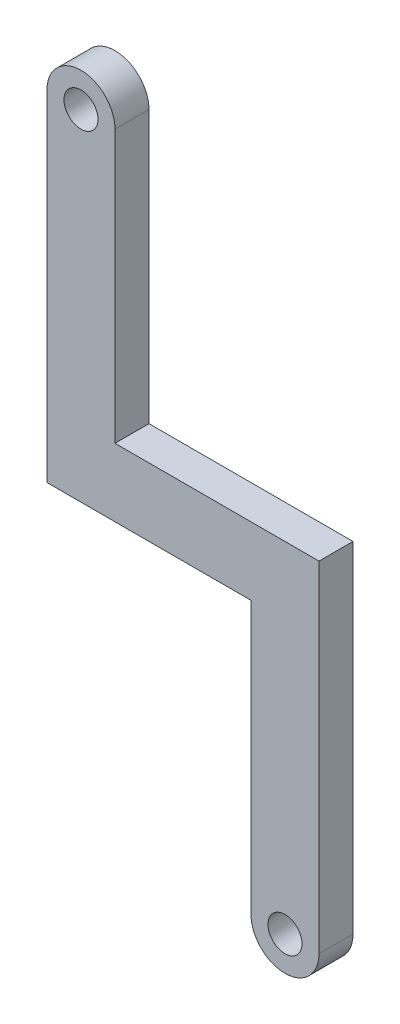
ISO-10303-21;
HEADER;
FILE_DESCRIPTION(('STEP AP214'),'2;1');
FILE_NAME('part.step','',(''),(''),'','','');
FILE_SCHEMA(('AUTOMOTIVE_DESIGN { 1 0 10303 214 1 1 1 1 }'));
ENDSEC;
DATA;
#1=APPLICATION_CONTEXT('core data for automotive mechanical design processes');
#2=APPLICATION_PROTOCOL_DEFINITION('international standard','automotive_design',2000,#1);
#3=PRODUCT_CONTEXT('',#1,'mechanical');
#4=PRODUCT('Part','Part','',(#3));
#5=PRODUCT_RELATED_PRODUCT_CATEGORY('part','',(#4));
#6=PRODUCT_DEFINITION_FORMATION('','',#4);
#7=PRODUCT_DEFINITION_CONTEXT('part definition',#1,'design');
#8=PRODUCT_DEFINITION('design','',#6,#7);
#9=PRODUCT_DEFINITION_SHAPE('','',#8);
#10=(LENGTH_UNIT() NAMED_UNIT(*) SI_UNIT(.MILLI.,.METRE.));
#11=(NAMED_UNIT(*) PLANE_ANGLE_UNIT() SI_UNIT($,.RADIAN.));
#12=(NAMED_UNIT(*) SI_UNIT($,.STERADIAN.) SOLID_ANGLE_UNIT());
#13=UNCERTAINTY_MEASURE_WITH_UNIT(LENGTH_MEASURE(1.E-05),#10,'distance_accuracy_value','');
#14=(GEOMETRIC_REPRESENTATION_CONTEXT(3) GLOBAL_UNCERTAINTY_ASSIGNED_CONTEXT((#13)) GLOBAL_UNIT_ASSIGNED_CONTEXT((#10,
#11,#12)) REPRESENTATION_CONTEXT('',''));
#15=CARTESIAN_POINT('',(0.,0.,0.));
#16=DIRECTION('',(0.,0.,1.));
#17=DIRECTION('',(1.,0.,0.));
#18=AXIS2_PLACEMENT_3D('',#15,#16,#17);
#19=CARTESIAN_POINT('',(-12.5,0.,2.5));
#20=DIRECTION('',(1.,0.,0.));
#21=DIRECTION('',(0.,1.,0.));
#22=AXIS2_PLACEMENT_3D('',#19,#20,#21);
#23=PLANE('',#22);
#24=DIRECTION('',(0.,-1.,0.));
#25=VECTOR('',#24,1.);
#26=CARTESIAN_POINT('',(-12.5,0.,0.));
#27=LINE('',#26,#25);
#28=CARTESIAN_POINT('',(-12.5,45.,0.));
#29=VERTEX_POINT('',#28);
#30=CARTESIAN_POINT('',(-12.5,24.9999999999999,0.));
#31=VERTEX_POINT('',#30);
#32=EDGE_CURVE('E138',#29,#31,#27,.T.);
#33=ORIENTED_EDGE('',*,*,#32,.F.);
#34=DIRECTION('',(0.,0.,-1.));
#35=VECTOR('',#34,1.);
#36=CARTESIAN_POINT('',(-12.5,45.,2.5));
#37=LINE('',#36,#35);
#38=CARTESIAN_POINT('',(-12.5,45.,2.5));
#39=VERTEX_POINT('',#38);
#40=EDGE_CURVE('E11',#39,#29,#37,.T.);
#41=ORIENTED_EDGE('',*,*,#40,.F.);
#42=DIRECTION('',(0.,-1.,0.));
#43=VECTOR('',#42,1.);
#44=CARTESIAN_POINT('',(-12.5,0.,2.5));
#45=LINE('',#44,#43);
#46=CARTESIAN_POINT('',(-12.5,24.9999999999999,2.5));
#47=VERTEX_POINT('',#46);
#48=EDGE_CURVE('E160',#39,#47,#45,.T.);
#49=ORIENTED_EDGE('',*,*,#48,.T.);
#50=DIRECTION('',(0.,0.,-1.));
#51=VECTOR('',#50,1.);
#52=CARTESIAN_POINT('',(-12.5,24.9999999999999,2.5));
#53=LINE('',#52,#51);
#54=EDGE_CURVE('E53',#47,#31,#53,.T.);
#55=ORIENTED_EDGE('',*,*,#54,.T.);
#56=EDGE_LOOP('',(#33,#41,#49,#55));
#57=FACE_BOUND('',#56,.T.);
#58=ADVANCED_FACE('F37',(#57),#23,.T.);
#59=CARTESIAN_POINT('',(-15.,45.,2.5));
#60=DIRECTION('',(0.,0.,-1.));
#61=DIRECTION('',(-1.,0.,0.));
#62=AXIS2_PLACEMENT_3D('',#59,#60,#61);
#63=CYLINDRICAL_SURFACE('',#62,2.5);
#64=CARTESIAN_POINT('',(-15.,45.,0.));
#65=DIRECTION('',(0.,0.,1.));
#66=DIRECTION('',(1.,0.,0.));
#67=AXIS2_PLACEMENT_3D('',#64,#65,#66);
#68=CIRCLE('',#67,2.5);
#69=CARTESIAN_POINT('',(-17.5,45.,0.));
#70=VERTEX_POINT('',#69);
#71=EDGE_CURVE('E140',#29,#70,#68,.T.);
#72=ORIENTED_EDGE('',*,*,#71,.T.);
#73=DIRECTION('',(0.,0.,-1.));
#74=VECTOR('',#73,1.);
#75=CARTESIAN_POINT('',(-17.5,45.,2.5));
#76=LINE('',#75,#74);
#77=CARTESIAN_POINT('',(-17.5,45.,2.5));
#78=VERTEX_POINT('',#77);
#79=EDGE_CURVE('E45',#78,#70,#76,.T.);
#80=ORIENTED_EDGE('',*,*,#79,.F.);
#81=CARTESIAN_POINT('',(-15.,45.,2.5));
#82=DIRECTION('',(0.,0.,1.));
#83=DIRECTION('',(1.,0.,0.));
#84=AXIS2_PLACEMENT_3D('',#81,#82,#83);
#85=CIRCLE('',#84,2.5);
#86=EDGE_CURVE('E194',#39,#78,#85,.T.);
#87=ORIENTED_EDGE('',*,*,#86,.F.);
#88=ORIENTED_EDGE('',*,*,#40,.T.);
#89=EDGE_LOOP('',(#72,#80,#87,#88));
#90=FACE_BOUND('',#89,.T.);
#91=ADVANCED_FACE('F211',(#90),#63,.T.);
#92=CARTESIAN_POINT('',(-17.5000000000001,0.,2.5));
#93=DIRECTION('',(1.,0.,0.));
#94=DIRECTION('',(0.,1.,0.));
#95=AXIS2_PLACEMENT_3D('',#92,#93,#94);
#96=PLANE('',#95);
#97=DIRECTION('',(0.,-1.,0.));
#98=VECTOR('',#97,1.);
#99=CARTESIAN_POINT('',(-17.5000000000001,0.,0.));
#100=LINE('',#99,#98);
#101=CARTESIAN_POINT('',(-17.5000000000001,19.9999999999999,0.));
#102=VERTEX_POINT('',#101);
#103=EDGE_CURVE('E142',#70,#102,#100,.T.);
#104=ORIENTED_EDGE('',*,*,#103,.T.);
#105=DIRECTION('',(0.,0.,-1.));
#106=VECTOR('',#105,1.);
#107=CARTESIAN_POINT('',(-17.5000000000001,19.9999999999999,2.5));
#108=LINE('',#107,#106);
#109=CARTESIAN_POINT('',(-17.5000000000001,19.9999999999999,2.5));
#110=VERTEX_POINT('',#109);
#111=EDGE_CURVE('E167',#110,#102,#108,.T.);
#112=ORIENTED_EDGE('',*,*,#111,.F.);
#113=DIRECTION('',(0.,-1.,0.));
#114=VECTOR('',#113,1.);
#115=CARTESIAN_POINT('',(-17.5000000000001,0.,2.5));
#116=LINE('',#115,#114);
#117=EDGE_CURVE('E176',#78,#110,#116,.T.);
#118=ORIENTED_EDGE('',*,*,#117,.F.);
#119=ORIENTED_EDGE('',*,*,#79,.T.);
#120=EDGE_LOOP('',(#104,#112,#118,#119));
#121=FACE_BOUND('',#120,.T.);
#122=ADVANCED_FACE('F174',(#121),#96,.F.);
#123=CARTESIAN_POINT('',(-1.48029736616687E-13,20.,2.5));
#124=DIRECTION('',(0.,1.,0.));
#125=DIRECTION('',(-1.,0.,0.));
#126=AXIS2_PLACEMENT_3D('',#123,#124,#125);
#127=PLANE('',#126);
#128=DIRECTION('',(1.,0.,0.));
#129=VECTOR('',#128,1.);
#130=CARTESIAN_POINT('',(-1.48029736616687E-13,20.,0.));
#131=LINE('',#130,#129);
#132=CARTESIAN_POINT('',(-2.5,20.,0.));
#133=VERTEX_POINT('',#132);
#134=EDGE_CURVE('E144',#102,#133,#131,.T.);
#135=ORIENTED_EDGE('',*,*,#134,.T.);
#136=DIRECTION('',(0.,0.,-1.));
#137=VECTOR('',#136,1.);
#138=CARTESIAN_POINT('',(-2.5,20.,2.5));
#139=LINE('',#138,#137);
#140=CARTESIAN_POINT('',(-2.5,20.,2.5));
#141=VERTEX_POINT('',#140);
#142=EDGE_CURVE('E164',#141,#133,#139,.T.);
#143=ORIENTED_EDGE('',*,*,#142,.F.);
#144=DIRECTION('',(1.,0.,0.));
#145=VECTOR('',#144,1.);
#146=CARTESIAN_POINT('',(-1.48029736616687E-13,20.,2.5));
#147=LINE('',#146,#145);
#148=EDGE_CURVE('E190',#110,#141,#147,.T.);
#149=ORIENTED_EDGE('',*,*,#148,.F.);
#150=ORIENTED_EDGE('',*,*,#111,.T.);
#151=EDGE_LOOP('',(#135,#143,#149,#150));
#152=FACE_BOUND('',#151,.T.);
#153=ADVANCED_FACE('F186',(#152),#127,.F.);
#154=CARTESIAN_POINT('',(-2.5,0.,2.5));
#155=DIRECTION('',(1.,0.,0.));
#156=DIRECTION('',(0.,1.,0.));
#157=AXIS2_PLACEMENT_3D('',#154,#155,#156);
#158=PLANE('',#157);
#159=DIRECTION('',(0.,-1.,0.));
#160=VECTOR('',#159,1.);
#161=CARTESIAN_POINT('',(-2.5,0.,0.));
#162=LINE('',#161,#160);
#163=CARTESIAN_POINT('',(-2.5,0.,0.));
#164=VERTEX_POINT('',#163);
#165=EDGE_CURVE('E146',#133,#164,#162,.T.);
#166=ORIENTED_EDGE('',*,*,#165,.T.);
#167=DIRECTION('',(0.,0.,-1.));
#168=VECTOR('',#167,1.);
#169=CARTESIAN_POINT('',(-2.5,0.,2.5));
#170=LINE('',#169,#168);
#171=CARTESIAN_POINT('',(-2.5,0.,2.5));
#172=VERTEX_POINT('',#171);
#173=EDGE_CURVE('E124',#172,#164,#170,.T.);
#174=ORIENTED_EDGE('',*,*,#173,.F.);
#175=DIRECTION('',(0.,-1.,0.));
#176=VECTOR('',#175,1.);
#177=CARTESIAN_POINT('',(-2.5,0.,2.5));
#178=LINE('',#177,#176);
#179=EDGE_CURVE('E112',#141,#172,#178,.T.);
#180=ORIENTED_EDGE('',*,*,#179,.F.);
#181=ORIENTED_EDGE('',*,*,#142,.T.);
#182=EDGE_LOOP('',(#166,#174,#180,#181));
#183=FACE_BOUND('',#182,.T.);
#184=ADVANCED_FACE('F189',(#183),#158,.F.);
#185=CARTESIAN_POINT('',(0.,0.,2.5));
#186=DIRECTION('',(0.,0.,-1.));
#187=DIRECTION('',(-1.,0.,0.));
#188=AXIS2_PLACEMENT_3D('',#185,#186,#187);
#189=CYLINDRICAL_SURFACE('',#188,2.5);
#190=CARTESIAN_POINT('',(0.,0.,0.));
#191=DIRECTION('',(0.,0.,1.));
#192=DIRECTION('',(1.,0.,0.));
#193=AXIS2_PLACEMENT_3D('',#190,#191,#192);
#194=CIRCLE('',#193,2.5);
#195=CARTESIAN_POINT('',(2.5,0.,0.));
#196=VERTEX_POINT('',#195);
#197=EDGE_CURVE('E121',#164,#196,#194,.T.);
#198=ORIENTED_EDGE('',*,*,#197,.T.);
#199=DIRECTION('',(0.,0.,-1.));
#200=VECTOR('',#199,1.);
#201=CARTESIAN_POINT('',(2.5,0.,2.5));
#202=LINE('',#201,#200);
#203=CARTESIAN_POINT('',(2.5,0.,2.5));
#204=VERTEX_POINT('',#203);
#205=EDGE_CURVE('E118',#204,#196,#202,.T.);
#206=ORIENTED_EDGE('',*,*,#205,.F.);
#207=CARTESIAN_POINT('',(0.,0.,2.5));
#208=DIRECTION('',(0.,0.,1.));
#209=DIRECTION('',(1.,0.,0.));
#210=AXIS2_PLACEMENT_3D('',#207,#208,#209);
#211=CIRCLE('',#210,2.5);
#212=EDGE_CURVE('E103',#172,#204,#211,.T.);
#213=ORIENTED_EDGE('',*,*,#212,.F.);
#214=ORIENTED_EDGE('',*,*,#173,.T.);
#215=EDGE_LOOP('',(#198,#206,#213,#214));
#216=FACE_BOUND('',#215,.T.);
#217=ADVANCED_FACE('F119',(#216),#189,.T.);
#218=CARTESIAN_POINT('',(2.5,0.,2.5));
#219=DIRECTION('',(1.,0.,0.));
#220=DIRECTION('',(0.,1.,0.));
#221=AXIS2_PLACEMENT_3D('',#218,#219,#220);
#222=PLANE('',#221);
#223=DIRECTION('',(0.,-1.,0.));
#224=VECTOR('',#223,1.);
#225=CARTESIAN_POINT('',(2.5,0.,0.));
#226=LINE('',#225,#224);
#227=CARTESIAN_POINT('',(2.5,25.,0.));
#228=VERTEX_POINT('',#227);
#229=EDGE_CURVE('E149',#228,#196,#226,.T.);
#230=ORIENTED_EDGE('',*,*,#229,.F.);
#231=DIRECTION('',(0.,0.,-1.));
#232=VECTOR('',#231,1.);
#233=CARTESIAN_POINT('',(2.5,25.,2.5));
#234=LINE('',#233,#232);
#235=CARTESIAN_POINT('',(2.5,25.,2.5));
#236=VERTEX_POINT('',#235);
#237=EDGE_CURVE('E78',#236,#228,#234,.T.);
#238=ORIENTED_EDGE('',*,*,#237,.F.);
#239=DIRECTION('',(0.,-1.,0.));
#240=VECTOR('',#239,1.);
#241=CARTESIAN_POINT('',(2.5,0.,2.5));
#242=LINE('',#241,#240);
#243=EDGE_CURVE('E110',#236,#204,#242,.T.);
#244=ORIENTED_EDGE('',*,*,#243,.T.);
#245=ORIENTED_EDGE('',*,*,#205,.T.);
#246=EDGE_LOOP('',(#230,#238,#244,#245));
#247=FACE_BOUND('',#246,.T.);
#248=ADVANCED_FACE('F126',(#247),#222,.T.);
#249=CARTESIAN_POINT('',(0.,0.,2.5));
#250=DIRECTION('',(0.,0.,-1.));
#251=DIRECTION('',(-1.,0.,0.));
#252=AXIS2_PLACEMENT_3D('',#249,#250,#251);
#253=CYLINDRICAL_SURFACE('',#252,1.25);
#254=CARTESIAN_POINT('',(0.,0.,2.5));
#255=DIRECTION('',(0.,0.,1.));
#256=DIRECTION('',(1.,0.,0.));
#257=AXIS2_PLACEMENT_3D('',#254,#255,#256);
#258=CIRCLE('',#257,1.25);
#259=CARTESIAN_POINT('',(1.25,0.,2.5));
#260=VERTEX_POINT('',#259);
#261=EDGE_CURVE('E129',#260,#260,#258,.T.);
#262=ORIENTED_EDGE('',*,*,#261,.T.);
#263=EDGE_LOOP('',(#262));
#264=FACE_BOUND('',#263,.T.);
#265=CARTESIAN_POINT('',(0.,0.,0.));
#266=DIRECTION('',(0.,0.,1.));
#267=DIRECTION('',(1.,0.,0.));
#268=AXIS2_PLACEMENT_3D('',#265,#266,#267);
#269=CIRCLE('',#268,1.25);
#270=CARTESIAN_POINT('',(1.25,0.,0.));
#271=VERTEX_POINT('',#270);
#272=EDGE_CURVE('E154',#271,#271,#269,.T.);
#273=ORIENTED_EDGE('',*,*,#272,.F.);
#274=EDGE_LOOP('',(#273));
#275=FACE_BOUND('',#274,.T.);
#276=ADVANCED_FACE('F199',(#264,#275),#253,.F.);
#277=CARTESIAN_POINT('',(-1.8503717077086E-13,25.,2.5));
#278=DIRECTION('',(0.,1.,0.));
#279=DIRECTION('',(-1.,0.,0.));
#280=AXIS2_PLACEMENT_3D('',#277,#278,#279);
#281=PLANE('',#280);
#282=DIRECTION('',(1.,0.,0.));
#283=VECTOR('',#282,1.);
#284=CARTESIAN_POINT('',(-1.8503717077086E-13,25.,0.));
#285=LINE('',#284,#283);
#286=EDGE_CURVE('E151',#31,#228,#285,.T.);
#287=ORIENTED_EDGE('',*,*,#286,.F.);
#288=ORIENTED_EDGE('',*,*,#54,.F.);
#289=DIRECTION('',(1.,0.,0.));
#290=VECTOR('',#289,1.);
#291=CARTESIAN_POINT('',(-1.8503717077086E-13,25.,2.5));
#292=LINE('',#291,#290);
#293=EDGE_CURVE('E127',#47,#236,#292,.T.);
#294=ORIENTED_EDGE('',*,*,#293,.T.);
#295=ORIENTED_EDGE('',*,*,#237,.T.);
#296=EDGE_LOOP('',(#287,#288,#294,#295));
#297=FACE_BOUND('',#296,.T.);
#298=ADVANCED_FACE('F196',(#297),#281,.T.);
#299=CARTESIAN_POINT('',(-15.,45.,2.5));
#300=DIRECTION('',(0.,0.,-1.));
#301=DIRECTION('',(-1.,0.,0.));
#302=AXIS2_PLACEMENT_3D('',#299,#300,#301);
#303=CYLINDRICAL_SURFACE('',#302,1.25);
#304=CARTESIAN_POINT('',(-15.,45.,2.5));
#305=DIRECTION('',(0.,0.,1.));
#306=DIRECTION('',(1.,0.,0.));
#307=AXIS2_PLACEMENT_3D('',#304,#305,#306);
#308=CIRCLE('',#307,1.25);
#309=CARTESIAN_POINT('',(-13.75,45.,2.5));
#310=VERTEX_POINT('',#309);
#311=EDGE_CURVE('E135',#310,#310,#308,.T.);
#312=ORIENTED_EDGE('',*,*,#311,.T.);
#313=EDGE_LOOP('',(#312));
#314=FACE_BOUND('',#313,.T.);
#315=CARTESIAN_POINT('',(-15.,45.,0.));
#316=DIRECTION('',(0.,0.,1.));
#317=DIRECTION('',(1.,0.,0.));
#318=AXIS2_PLACEMENT_3D('',#315,#316,#317);
#319=CIRCLE('',#318,1.25);
#320=CARTESIAN_POINT('',(-13.75,45.,0.));
#321=VERTEX_POINT('',#320);
#322=EDGE_CURVE('E157',#321,#321,#319,.T.);
#323=ORIENTED_EDGE('',*,*,#322,.F.);
#324=EDGE_LOOP('',(#323));
#325=FACE_BOUND('',#324,.T.);
#326=ADVANCED_FACE('F198',(#314,#325),#303,.F.);
#327=CARTESIAN_POINT('',(0.,0.,2.5));
#328=DIRECTION('',(0.,0.,1.));
#329=DIRECTION('',(1.,0.,0.));
#330=AXIS2_PLACEMENT_3D('',#327,#328,#329);
#331=PLANE('',#330);
#332=ORIENTED_EDGE('',*,*,#48,.F.);
#333=ORIENTED_EDGE('',*,*,#86,.T.);
#334=ORIENTED_EDGE('',*,*,#117,.T.);
#335=ORIENTED_EDGE('',*,*,#148,.T.);
#336=ORIENTED_EDGE('',*,*,#179,.T.);
#337=ORIENTED_EDGE('',*,*,#212,.T.);
#338=ORIENTED_EDGE('',*,*,#243,.F.);
#339=ORIENTED_EDGE('',*,*,#293,.F.);
#340=EDGE_LOOP('',(#332,#333,#334,#335,#336,#337,#338,#339));
#341=FACE_BOUND('',#340,.T.);
#342=ORIENTED_EDGE('',*,*,#261,.F.);
#343=EDGE_LOOP('',(#342));
#344=FACE_BOUND('',#343,.T.);
#345=ORIENTED_EDGE('',*,*,#311,.F.);
#346=EDGE_LOOP('',(#345));
#347=FACE_BOUND('',#346,.T.);
#348=ADVANCED_FACE('F106',(#341,#344,#347),#331,.T.);
#349=CARTESIAN_POINT('',(0.,0.,0.));
#350=DIRECTION('',(0.,0.,1.));
#351=DIRECTION('',(1.,0.,0.));
#352=AXIS2_PLACEMENT_3D('',#349,#350,#351);
#353=PLANE('',#352);
#354=ORIENTED_EDGE('',*,*,#32,.T.);
#355=ORIENTED_EDGE('',*,*,#286,.T.);
#356=ORIENTED_EDGE('',*,*,#229,.T.);
#357=ORIENTED_EDGE('',*,*,#197,.F.);
#358=ORIENTED_EDGE('',*,*,#165,.F.);
#359=ORIENTED_EDGE('',*,*,#134,.F.);
#360=ORIENTED_EDGE('',*,*,#103,.F.);
#361=ORIENTED_EDGE('',*,*,#71,.F.);
#362=EDGE_LOOP('',(#354,#355,#356,#357,#358,#359,#360,#361));
#363=FACE_BOUND('',#362,.T.);
#364=ORIENTED_EDGE('',*,*,#272,.T.);
#365=EDGE_LOOP('',(#364));
#366=FACE_BOUND('',#365,.T.);
#367=ORIENTED_EDGE('',*,*,#322,.T.);
#368=EDGE_LOOP('',(#367));
#369=FACE_BOUND('',#368,.T.);
#370=ADVANCED_FACE('F181',(#363,#366,#369),#353,.F.);
#371=CLOSED_SHELL('',(#58,#91,#122,#153,#184,#217,#248,#276,#298,#326,#348,#370));
#372=MANIFOLD_SOLID_BREP('B2',#371);
#373=ADVANCED_BREP_SHAPE_REPRESENTATION('',(#18,#372),#14);
#374=SHAPE_DEFINITION_REPRESENTATION(#9,#373);
ENDSEC;
END-ISO-10303-21;
